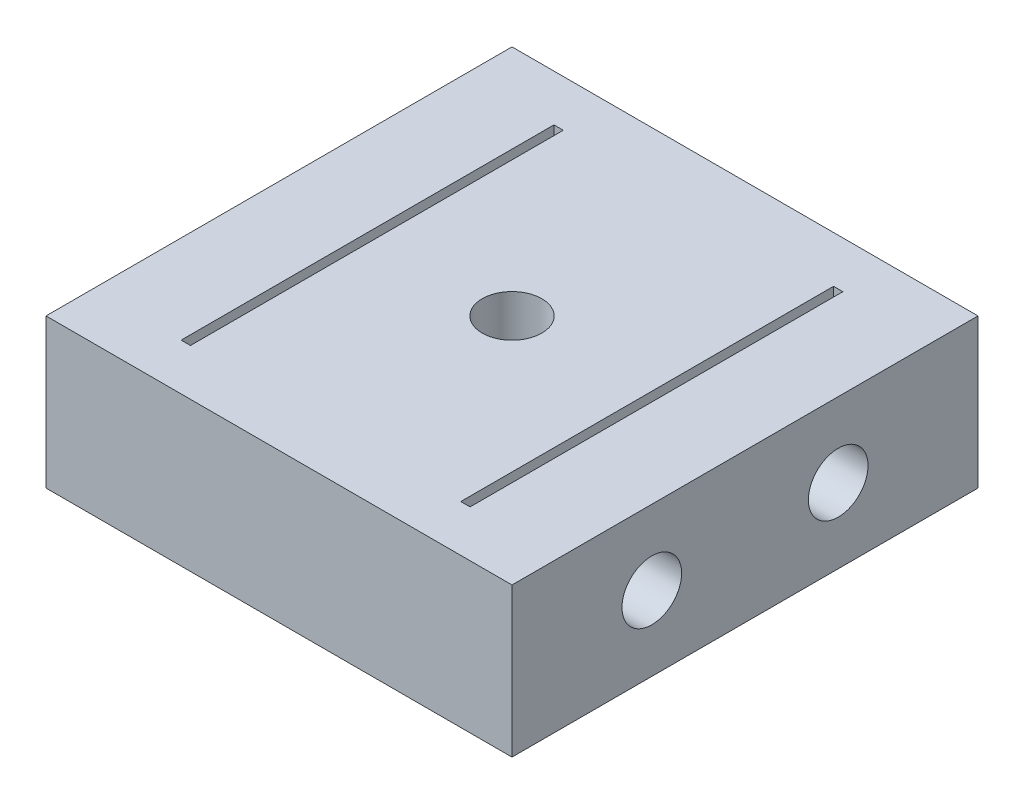
ISO-10303-21;
HEADER;
FILE_DESCRIPTION(('STEP AP214'),'2;1');
FILE_NAME('part.step','',(''),(''),'','','');
FILE_SCHEMA(('AUTOMOTIVE_DESIGN { 1 0 10303 214 1 1 1 1 }'));
ENDSEC;
DATA;
#1=APPLICATION_CONTEXT('core data for automotive mechanical design processes');
#2=APPLICATION_PROTOCOL_DEFINITION('international standard','automotive_design',2000,#1);
#3=PRODUCT_CONTEXT('',#1,'mechanical');
#4=PRODUCT('Part','Part','',(#3));
#5=PRODUCT_RELATED_PRODUCT_CATEGORY('part','',(#4));
#6=PRODUCT_DEFINITION_FORMATION('','',#4);
#7=PRODUCT_DEFINITION_CONTEXT('part definition',#1,'design');
#8=PRODUCT_DEFINITION('design','',#6,#7);
#9=PRODUCT_DEFINITION_SHAPE('','',#8);
#10=(LENGTH_UNIT() NAMED_UNIT(*) SI_UNIT(.MILLI.,.METRE.));
#11=(NAMED_UNIT(*) PLANE_ANGLE_UNIT() SI_UNIT($,.RADIAN.));
#12=(NAMED_UNIT(*) SI_UNIT($,.STERADIAN.) SOLID_ANGLE_UNIT());
#13=UNCERTAINTY_MEASURE_WITH_UNIT(LENGTH_MEASURE(1.E-05),#10,'distance_accuracy_value','');
#14=(GEOMETRIC_REPRESENTATION_CONTEXT(3) GLOBAL_UNCERTAINTY_ASSIGNED_CONTEXT((#13)) GLOBAL_UNIT_ASSIGNED_CONTEXT((#10,
#11,#12)) REPRESENTATION_CONTEXT('',''));
#15=CARTESIAN_POINT('',(0.,0.,0.));
#16=DIRECTION('',(0.,0.,1.));
#17=DIRECTION('',(1.,0.,0.));
#18=AXIS2_PLACEMENT_3D('',#15,#16,#17);
#19=CARTESIAN_POINT('',(0.,8.,0.));
#20=DIRECTION('',(0.,-1.,0.));
#21=DIRECTION('',(0.,0.,-1.));
#22=AXIS2_PLACEMENT_3D('',#19,#20,#21);
#23=PLANE('',#22);
#24=DIRECTION('',(0.,0.,1.));
#25=VECTOR('',#24,1.);
#26=CARTESIAN_POINT('',(4.74999999999998,8.,-22.5));
#27=LINE('',#26,#25);
#28=CARTESIAN_POINT('',(4.74999999999998,8.,-22.5));
#29=VERTEX_POINT('',#28);
#30=CARTESIAN_POINT('',(4.74999999999998,8.,-2.5));
#31=VERTEX_POINT('',#30);
#32=EDGE_CURVE('E169',#29,#31,#27,.T.);
#33=ORIENTED_EDGE('',*,*,#32,.F.);
#34=DIRECTION('',(-1.,0.,0.));
#35=VECTOR('',#34,1.);
#36=CARTESIAN_POINT('',(4.74999999999998,8.,-22.5));
#37=LINE('',#36,#35);
#38=CARTESIAN_POINT('',(5.24999999999998,8.,-22.5));
#39=VERTEX_POINT('',#38);
#40=EDGE_CURVE('E177',#39,#29,#37,.T.);
#41=ORIENTED_EDGE('',*,*,#40,.F.);
#42=DIRECTION('',(0.,0.,-1.));
#43=VECTOR('',#42,1.);
#44=CARTESIAN_POINT('',(5.24999999999998,8.,-22.5));
#45=LINE('',#44,#43);
#46=CARTESIAN_POINT('',(5.24999999999998,8.,-2.5));
#47=VERTEX_POINT('',#46);
#48=EDGE_CURVE('E174',#47,#39,#45,.T.);
#49=ORIENTED_EDGE('',*,*,#48,.F.);
#50=DIRECTION('',(1.,0.,0.));
#51=VECTOR('',#50,1.);
#52=CARTESIAN_POINT('',(4.74999999999998,8.,-2.5));
#53=LINE('',#52,#51);
#54=EDGE_CURVE('E171',#31,#47,#53,.T.);
#55=ORIENTED_EDGE('',*,*,#54,.F.);
#56=EDGE_LOOP('',(#33,#41,#49,#55));
#57=FACE_BOUND('',#56,.T.);
#58=DIRECTION('',(0.,0.,1.));
#59=VECTOR('',#58,1.);
#60=CARTESIAN_POINT('',(0.,8.,0.));
#61=LINE('',#60,#59);
#62=CARTESIAN_POINT('',(0.,8.,-25.));
#63=VERTEX_POINT('',#62);
#64=CARTESIAN_POINT('',(0.,8.,0.));
#65=VERTEX_POINT('',#64);
#66=EDGE_CURVE('E200',#63,#65,#61,.T.);
#67=ORIENTED_EDGE('',*,*,#66,.T.);
#68=DIRECTION('',(1.,0.,0.));
#69=VECTOR('',#68,1.);
#70=CARTESIAN_POINT('',(0.,8.,0.));
#71=LINE('',#70,#69);
#72=CARTESIAN_POINT('',(25.,8.,0.));
#73=VERTEX_POINT('',#72);
#74=EDGE_CURVE('E203',#65,#73,#71,.T.);
#75=ORIENTED_EDGE('',*,*,#74,.T.);
#76=DIRECTION('',(0.,0.,-1.));
#77=VECTOR('',#76,1.);
#78=CARTESIAN_POINT('',(25.,8.,0.));
#79=LINE('',#78,#77);
#80=CARTESIAN_POINT('',(25.,8.,-25.));
#81=VERTEX_POINT('',#80);
#82=EDGE_CURVE('E206',#73,#81,#79,.T.);
#83=ORIENTED_EDGE('',*,*,#82,.T.);
#84=DIRECTION('',(-1.,0.,0.));
#85=VECTOR('',#84,1.);
#86=CARTESIAN_POINT('',(0.,8.,-25.));
#87=LINE('',#86,#85);
#88=EDGE_CURVE('E208',#81,#63,#87,.T.);
#89=ORIENTED_EDGE('',*,*,#88,.T.);
#90=EDGE_LOOP('',(#67,#75,#83,#89));
#91=FACE_BOUND('',#90,.T.);
#92=DIRECTION('',(0.,0.,1.));
#93=VECTOR('',#92,1.);
#94=CARTESIAN_POINT('',(19.75,8.,-22.5));
#95=LINE('',#94,#93);
#96=CARTESIAN_POINT('',(19.75,8.,-22.5));
#97=VERTEX_POINT('',#96);
#98=CARTESIAN_POINT('',(19.75,8.,-2.5));
#99=VERTEX_POINT('',#98);
#100=EDGE_CURVE('E130',#97,#99,#95,.T.);
#101=ORIENTED_EDGE('',*,*,#100,.F.);
#102=DIRECTION('',(-1.,0.,0.));
#103=VECTOR('',#102,1.);
#104=CARTESIAN_POINT('',(19.75,8.,-22.5));
#105=LINE('',#104,#103);
#106=CARTESIAN_POINT('',(20.25,8.,-22.5));
#107=VERTEX_POINT('',#106);
#108=EDGE_CURVE('E153',#107,#97,#105,.T.);
#109=ORIENTED_EDGE('',*,*,#108,.F.);
#110=DIRECTION('',(0.,0.,-1.));
#111=VECTOR('',#110,1.);
#112=CARTESIAN_POINT('',(20.25,8.,-22.5));
#113=LINE('',#112,#111);
#114=CARTESIAN_POINT('',(20.25,8.,-2.5));
#115=VERTEX_POINT('',#114);
#116=EDGE_CURVE('E151',#115,#107,#113,.T.);
#117=ORIENTED_EDGE('',*,*,#116,.F.);
#118=DIRECTION('',(1.,0.,0.));
#119=VECTOR('',#118,1.);
#120=CARTESIAN_POINT('',(19.75,8.,-2.5));
#121=LINE('',#120,#119);
#122=EDGE_CURVE('E138',#99,#115,#121,.T.);
#123=ORIENTED_EDGE('',*,*,#122,.F.);
#124=EDGE_LOOP('',(#101,#109,#117,#123));
#125=FACE_BOUND('',#124,.T.);
#126=CARTESIAN_POINT('',(12.5,8.,-12.5));
#127=DIRECTION('',(0.,1.,0.));
#128=DIRECTION('',(0.,0.,1.));
#129=AXIS2_PLACEMENT_3D('',#126,#127,#128);
#130=CIRCLE('',#129,1.6);
#131=CARTESIAN_POINT('',(12.5,8.,-10.9));
#132=VERTEX_POINT('',#131);
#133=EDGE_CURVE('E159',#132,#132,#130,.T.);
#134=ORIENTED_EDGE('',*,*,#133,.F.);
#135=EDGE_LOOP('',(#134));
#136=FACE_BOUND('',#135,.T.);
#137=ADVANCED_FACE('F39',(#57,#91,#125,#136),#23,.F.);
#138=CARTESIAN_POINT('',(0.,0.,0.));
#139=DIRECTION('',(0.,-1.,0.));
#140=DIRECTION('',(0.,0.,-1.));
#141=AXIS2_PLACEMENT_3D('',#138,#139,#140);
#142=PLANE('',#141);
#143=DIRECTION('',(-1.,0.,0.));
#144=VECTOR('',#143,1.);
#145=CARTESIAN_POINT('',(19.75,0.,-22.5));
#146=LINE('',#145,#144);
#147=CARTESIAN_POINT('',(20.25,0.,-22.5));
#148=VERTEX_POINT('',#147);
#149=CARTESIAN_POINT('',(19.75,0.,-22.5));
#150=VERTEX_POINT('',#149);
#151=EDGE_CURVE('E139',#148,#150,#146,.T.);
#152=ORIENTED_EDGE('',*,*,#151,.T.);
#153=DIRECTION('',(0.,0.,1.));
#154=VECTOR('',#153,1.);
#155=CARTESIAN_POINT('',(19.75,0.,-22.5));
#156=LINE('',#155,#154);
#157=CARTESIAN_POINT('',(19.75,0.,-2.5));
#158=VERTEX_POINT('',#157);
#159=EDGE_CURVE('E64',#150,#158,#156,.T.);
#160=ORIENTED_EDGE('',*,*,#159,.T.);
#161=DIRECTION('',(1.,0.,0.));
#162=VECTOR('',#161,1.);
#163=CARTESIAN_POINT('',(19.75,0.,-2.5));
#164=LINE('',#163,#162);
#165=CARTESIAN_POINT('',(20.25,0.,-2.5));
#166=VERTEX_POINT('',#165);
#167=EDGE_CURVE('E145',#158,#166,#164,.T.);
#168=ORIENTED_EDGE('',*,*,#167,.T.);
#169=DIRECTION('',(0.,0.,-1.));
#170=VECTOR('',#169,1.);
#171=CARTESIAN_POINT('',(20.25,0.,-22.5));
#172=LINE('',#171,#170);
#173=EDGE_CURVE('E161',#166,#148,#172,.T.);
#174=ORIENTED_EDGE('',*,*,#173,.T.);
#175=EDGE_LOOP('',(#152,#160,#168,#174));
#176=FACE_BOUND('',#175,.T.);
#177=DIRECTION('',(-1.,0.,0.));
#178=VECTOR('',#177,1.);
#179=CARTESIAN_POINT('',(4.74999999999998,0.,-22.5));
#180=LINE('',#179,#178);
#181=CARTESIAN_POINT('',(5.24999999999998,0.,-22.5));
#182=VERTEX_POINT('',#181);
#183=CARTESIAN_POINT('',(4.74999999999998,0.,-22.5));
#184=VERTEX_POINT('',#183);
#185=EDGE_CURVE('E172',#182,#184,#180,.T.);
#186=ORIENTED_EDGE('',*,*,#185,.T.);
#187=DIRECTION('',(0.,0.,1.));
#188=VECTOR('',#187,1.);
#189=CARTESIAN_POINT('',(4.74999999999998,0.,-22.5));
#190=LINE('',#189,#188);
#191=CARTESIAN_POINT('',(4.74999999999998,0.,-2.5));
#192=VERTEX_POINT('',#191);
#193=EDGE_CURVE('E146',#184,#192,#190,.T.);
#194=ORIENTED_EDGE('',*,*,#193,.T.);
#195=DIRECTION('',(1.,0.,0.));
#196=VECTOR('',#195,1.);
#197=CARTESIAN_POINT('',(4.74999999999998,0.,-2.5));
#198=LINE('',#197,#196);
#199=CARTESIAN_POINT('',(5.24999999999998,0.,-2.5));
#200=VERTEX_POINT('',#199);
#201=EDGE_CURVE('E182',#192,#200,#198,.T.);
#202=ORIENTED_EDGE('',*,*,#201,.T.);
#203=DIRECTION('',(0.,0.,-1.));
#204=VECTOR('',#203,1.);
#205=CARTESIAN_POINT('',(5.24999999999998,0.,-22.5));
#206=LINE('',#205,#204);
#207=EDGE_CURVE('E185',#200,#182,#206,.T.);
#208=ORIENTED_EDGE('',*,*,#207,.T.);
#209=EDGE_LOOP('',(#186,#194,#202,#208));
#210=FACE_BOUND('',#209,.T.);
#211=DIRECTION('',(0.,0.,1.));
#212=VECTOR('',#211,1.);
#213=CARTESIAN_POINT('',(0.,0.,0.));
#214=LINE('',#213,#212);
#215=CARTESIAN_POINT('',(0.,0.,-25.));
#216=VERTEX_POINT('',#215);
#217=CARTESIAN_POINT('',(0.,0.,0.));
#218=VERTEX_POINT('',#217);
#219=EDGE_CURVE('E199',#216,#218,#214,.T.);
#220=ORIENTED_EDGE('',*,*,#219,.F.);
#221=DIRECTION('',(-1.,0.,0.));
#222=VECTOR('',#221,1.);
#223=CARTESIAN_POINT('',(0.,0.,-25.));
#224=LINE('',#223,#222);
#225=CARTESIAN_POINT('',(25.,0.,-25.));
#226=VERTEX_POINT('',#225);
#227=EDGE_CURVE('E204',#226,#216,#224,.T.);
#228=ORIENTED_EDGE('',*,*,#227,.F.);
#229=DIRECTION('',(0.,0.,-1.));
#230=VECTOR('',#229,1.);
#231=CARTESIAN_POINT('',(25.,0.,0.));
#232=LINE('',#231,#230);
#233=CARTESIAN_POINT('',(25.,0.,0.));
#234=VERTEX_POINT('',#233);
#235=EDGE_CURVE('E215',#234,#226,#232,.T.);
#236=ORIENTED_EDGE('',*,*,#235,.F.);
#237=DIRECTION('',(1.,0.,0.));
#238=VECTOR('',#237,1.);
#239=CARTESIAN_POINT('',(0.,0.,0.));
#240=LINE('',#239,#238);
#241=EDGE_CURVE('E213',#218,#234,#240,.T.);
#242=ORIENTED_EDGE('',*,*,#241,.F.);
#243=EDGE_LOOP('',(#220,#228,#236,#242));
#244=FACE_BOUND('',#243,.T.);
#245=CARTESIAN_POINT('',(12.5,0.,-12.5));
#246=DIRECTION('',(0.,1.,0.));
#247=DIRECTION('',(0.,0.,1.));
#248=AXIS2_PLACEMENT_3D('',#245,#246,#247);
#249=CIRCLE('',#248,1.6);
#250=CARTESIAN_POINT('',(12.5,0.,-10.9));
#251=VERTEX_POINT('',#250);
#252=EDGE_CURVE('E261',#251,#251,#249,.T.);
#253=ORIENTED_EDGE('',*,*,#252,.T.);
#254=EDGE_LOOP('',(#253));
#255=FACE_BOUND('',#254,.T.);
#256=ADVANCED_FACE('F266',(#176,#210,#244,#255),#142,.T.);
#257=CARTESIAN_POINT('',(0.,8.,0.));
#258=DIRECTION('',(1.,0.,0.));
#259=DIRECTION('',(0.,0.,-1.));
#260=AXIS2_PLACEMENT_3D('',#257,#258,#259);
#261=PLANE('',#260);
#262=CARTESIAN_POINT('',(0.,4.,-7.5));
#263=DIRECTION('',(1.,0.,0.));
#264=DIRECTION('',(0.,0.,-1.));
#265=AXIS2_PLACEMENT_3D('',#262,#263,#264);
#266=CIRCLE('',#265,1.6);
#267=CARTESIAN_POINT('',(0.,4.,-9.1));
#268=VERTEX_POINT('',#267);
#269=EDGE_CURVE('E227',#268,#268,#266,.T.);
#270=ORIENTED_EDGE('',*,*,#269,.T.);
#271=EDGE_LOOP('',(#270));
#272=FACE_BOUND('',#271,.T.);
#273=CARTESIAN_POINT('',(0.,4.,-17.5));
#274=DIRECTION('',(1.,0.,0.));
#275=DIRECTION('',(0.,0.,-1.));
#276=AXIS2_PLACEMENT_3D('',#273,#274,#275);
#277=CIRCLE('',#276,1.6);
#278=CARTESIAN_POINT('',(0.,4.,-19.1));
#279=VERTEX_POINT('',#278);
#280=EDGE_CURVE('E244',#279,#279,#277,.T.);
#281=ORIENTED_EDGE('',*,*,#280,.T.);
#282=EDGE_LOOP('',(#281));
#283=FACE_BOUND('',#282,.T.);
#284=ORIENTED_EDGE('',*,*,#219,.T.);
#285=DIRECTION('',(0.,-1.,0.));
#286=VECTOR('',#285,1.);
#287=CARTESIAN_POINT('',(0.,8.,0.));
#288=LINE('',#287,#286);
#289=EDGE_CURVE('E11',#65,#218,#288,.T.);
#290=ORIENTED_EDGE('',*,*,#289,.F.);
#291=ORIENTED_EDGE('',*,*,#66,.F.);
#292=DIRECTION('',(0.,-1.,0.));
#293=VECTOR('',#292,1.);
#294=CARTESIAN_POINT('',(0.,8.,-25.));
#295=LINE('',#294,#293);
#296=EDGE_CURVE('E210',#63,#216,#295,.T.);
#297=ORIENTED_EDGE('',*,*,#296,.T.);
#298=EDGE_LOOP('',(#284,#290,#291,#297));
#299=FACE_BOUND('',#298,.T.);
#300=ADVANCED_FACE('F41',(#272,#283,#299),#261,.F.);
#301=CARTESIAN_POINT('',(0.,8.,0.));
#302=DIRECTION('',(0.,0.,-1.));
#303=DIRECTION('',(-1.,0.,0.));
#304=AXIS2_PLACEMENT_3D('',#301,#302,#303);
#305=PLANE('',#304);
#306=ORIENTED_EDGE('',*,*,#241,.T.);
#307=DIRECTION('',(0.,-1.,0.));
#308=VECTOR('',#307,1.);
#309=CARTESIAN_POINT('',(25.,8.,0.));
#310=LINE('',#309,#308);
#311=EDGE_CURVE('E48',#73,#234,#310,.T.);
#312=ORIENTED_EDGE('',*,*,#311,.F.);
#313=ORIENTED_EDGE('',*,*,#74,.F.);
#314=ORIENTED_EDGE('',*,*,#289,.T.);
#315=EDGE_LOOP('',(#306,#312,#313,#314));
#316=FACE_BOUND('',#315,.T.);
#317=ADVANCED_FACE('F305',(#316),#305,.F.);
#318=CARTESIAN_POINT('',(25.,8.,0.));
#319=DIRECTION('',(-1.,0.,0.));
#320=DIRECTION('',(0.,0.,1.));
#321=AXIS2_PLACEMENT_3D('',#318,#319,#320);
#322=PLANE('',#321);
#323=CARTESIAN_POINT('',(25.,4.,-7.5));
#324=DIRECTION('',(1.,0.,0.));
#325=DIRECTION('',(0.,0.,-1.));
#326=AXIS2_PLACEMENT_3D('',#323,#324,#325);
#327=CIRCLE('',#326,1.6);
#328=CARTESIAN_POINT('',(25.,4.,-9.1));
#329=VERTEX_POINT('',#328);
#330=EDGE_CURVE('E234',#329,#329,#327,.T.);
#331=ORIENTED_EDGE('',*,*,#330,.F.);
#332=EDGE_LOOP('',(#331));
#333=FACE_BOUND('',#332,.T.);
#334=CARTESIAN_POINT('',(25.,4.,-17.5));
#335=DIRECTION('',(1.,0.,0.));
#336=DIRECTION('',(0.,0.,-1.));
#337=AXIS2_PLACEMENT_3D('',#334,#335,#336);
#338=CIRCLE('',#337,1.6);
#339=CARTESIAN_POINT('',(25.,4.,-19.1));
#340=VERTEX_POINT('',#339);
#341=EDGE_CURVE('E239',#340,#340,#338,.T.);
#342=ORIENTED_EDGE('',*,*,#341,.F.);
#343=EDGE_LOOP('',(#342));
#344=FACE_BOUND('',#343,.T.);
#345=ORIENTED_EDGE('',*,*,#235,.T.);
#346=DIRECTION('',(0.,-1.,0.));
#347=VECTOR('',#346,1.);
#348=CARTESIAN_POINT('',(25.,8.,-25.));
#349=LINE('',#348,#347);
#350=EDGE_CURVE('E220',#81,#226,#349,.T.);
#351=ORIENTED_EDGE('',*,*,#350,.F.);
#352=ORIENTED_EDGE('',*,*,#82,.F.);
#353=ORIENTED_EDGE('',*,*,#311,.T.);
#354=EDGE_LOOP('',(#345,#351,#352,#353));
#355=FACE_BOUND('',#354,.T.);
#356=ADVANCED_FACE('F302',(#333,#344,#355),#322,.F.);
#357=CARTESIAN_POINT('',(0.,8.,-25.));
#358=DIRECTION('',(0.,0.,1.));
#359=DIRECTION('',(1.,0.,0.));
#360=AXIS2_PLACEMENT_3D('',#357,#358,#359);
#361=PLANE('',#360);
#362=ORIENTED_EDGE('',*,*,#227,.T.);
#363=ORIENTED_EDGE('',*,*,#296,.F.);
#364=ORIENTED_EDGE('',*,*,#88,.F.);
#365=ORIENTED_EDGE('',*,*,#350,.T.);
#366=EDGE_LOOP('',(#362,#363,#364,#365));
#367=FACE_BOUND('',#366,.T.);
#368=ADVANCED_FACE('F299',(#367),#361,.F.);
#369=CARTESIAN_POINT('',(4.74999999999998,8.,-22.5));
#370=DIRECTION('',(1.,0.,0.));
#371=DIRECTION('',(0.,0.,-1.));
#372=AXIS2_PLACEMENT_3D('',#369,#370,#371);
#373=PLANE('',#372);
#374=CARTESIAN_POINT('',(4.74999999999998,4.,-7.5));
#375=DIRECTION('',(1.,0.,0.));
#376=DIRECTION('',(0.,0.,-1.));
#377=AXIS2_PLACEMENT_3D('',#374,#375,#376);
#378=CIRCLE('',#377,1.6);
#379=CARTESIAN_POINT('',(4.74999999999998,4.,-9.1));
#380=VERTEX_POINT('',#379);
#381=EDGE_CURVE('E258',#380,#380,#378,.T.);
#382=ORIENTED_EDGE('',*,*,#381,.F.);
#383=EDGE_LOOP('',(#382));
#384=FACE_BOUND('',#383,.T.);
#385=CARTESIAN_POINT('',(4.74999999999998,4.,-17.5));
#386=DIRECTION('',(1.,0.,0.));
#387=DIRECTION('',(0.,0.,-1.));
#388=AXIS2_PLACEMENT_3D('',#385,#386,#387);
#389=CIRCLE('',#388,1.6);
#390=CARTESIAN_POINT('',(4.74999999999998,4.,-19.1));
#391=VERTEX_POINT('',#390);
#392=EDGE_CURVE('E249',#391,#391,#389,.T.);
#393=ORIENTED_EDGE('',*,*,#392,.F.);
#394=EDGE_LOOP('',(#393));
#395=FACE_BOUND('',#394,.T.);
#396=ORIENTED_EDGE('',*,*,#193,.F.);
#397=DIRECTION('',(0.,-1.,0.));
#398=VECTOR('',#397,1.);
#399=CARTESIAN_POINT('',(4.74999999999998,8.,-22.5));
#400=LINE('',#399,#398);
#401=EDGE_CURVE('E179',#29,#184,#400,.T.);
#402=ORIENTED_EDGE('',*,*,#401,.F.);
#403=ORIENTED_EDGE('',*,*,#32,.T.);
#404=DIRECTION('',(0.,-1.,0.));
#405=VECTOR('',#404,1.);
#406=CARTESIAN_POINT('',(4.74999999999998,8.,-2.5));
#407=LINE('',#406,#405);
#408=EDGE_CURVE('E196',#31,#192,#407,.T.);
#409=ORIENTED_EDGE('',*,*,#408,.T.);
#410=EDGE_LOOP('',(#396,#402,#403,#409));
#411=FACE_BOUND('',#410,.T.);
#412=ADVANCED_FACE('F296',(#384,#395,#411),#373,.T.);
#413=CARTESIAN_POINT('',(4.74999999999998,8.,-2.5));
#414=DIRECTION('',(0.,0.,-1.));
#415=DIRECTION('',(-1.,0.,0.));
#416=AXIS2_PLACEMENT_3D('',#413,#414,#415);
#417=PLANE('',#416);
#418=ORIENTED_EDGE('',*,*,#201,.F.);
#419=ORIENTED_EDGE('',*,*,#408,.F.);
#420=ORIENTED_EDGE('',*,*,#54,.T.);
#421=DIRECTION('',(0.,-1.,0.));
#422=VECTOR('',#421,1.);
#423=CARTESIAN_POINT('',(5.24999999999998,8.,-2.5));
#424=LINE('',#423,#422);
#425=EDGE_CURVE('E194',#47,#200,#424,.T.);
#426=ORIENTED_EDGE('',*,*,#425,.T.);
#427=EDGE_LOOP('',(#418,#419,#420,#426));
#428=FACE_BOUND('',#427,.T.);
#429=ADVANCED_FACE('F367',(#428),#417,.T.);
#430=CARTESIAN_POINT('',(5.24999999999998,8.,-22.5));
#431=DIRECTION('',(-1.,0.,0.));
#432=DIRECTION('',(0.,0.,1.));
#433=AXIS2_PLACEMENT_3D('',#430,#431,#432);
#434=PLANE('',#433);
#435=CARTESIAN_POINT('',(5.24999999999998,4.,-7.5));
#436=DIRECTION('',(-1.,0.,0.));
#437=DIRECTION('',(0.,0.,1.));
#438=AXIS2_PLACEMENT_3D('',#435,#436,#437);
#439=CIRCLE('',#438,1.6);
#440=CARTESIAN_POINT('',(5.24999999999998,4.,-5.9));
#441=VERTEX_POINT('',#440);
#442=EDGE_CURVE('E255',#441,#441,#439,.T.);
#443=ORIENTED_EDGE('',*,*,#442,.F.);
#444=EDGE_LOOP('',(#443));
#445=FACE_BOUND('',#444,.T.);
#446=CARTESIAN_POINT('',(5.24999999999998,4.,-17.5));
#447=DIRECTION('',(-1.,0.,0.));
#448=DIRECTION('',(0.,0.,1.));
#449=AXIS2_PLACEMENT_3D('',#446,#447,#448);
#450=CIRCLE('',#449,1.6);
#451=CARTESIAN_POINT('',(5.24999999999998,4.,-15.9));
#452=VERTEX_POINT('',#451);
#453=EDGE_CURVE('E231',#452,#452,#450,.T.);
#454=ORIENTED_EDGE('',*,*,#453,.F.);
#455=EDGE_LOOP('',(#454));
#456=FACE_BOUND('',#455,.T.);
#457=ORIENTED_EDGE('',*,*,#207,.F.);
#458=ORIENTED_EDGE('',*,*,#425,.F.);
#459=ORIENTED_EDGE('',*,*,#48,.T.);
#460=DIRECTION('',(0.,-1.,0.));
#461=VECTOR('',#460,1.);
#462=CARTESIAN_POINT('',(5.24999999999998,8.,-22.5));
#463=LINE('',#462,#461);
#464=EDGE_CURVE('E192',#39,#182,#463,.T.);
#465=ORIENTED_EDGE('',*,*,#464,.T.);
#466=EDGE_LOOP('',(#457,#458,#459,#465));
#467=FACE_BOUND('',#466,.T.);
#468=ADVANCED_FACE('F361',(#445,#456,#467),#434,.T.);
#469=CARTESIAN_POINT('',(4.74999999999998,8.,-22.5));
#470=DIRECTION('',(0.,0.,1.));
#471=DIRECTION('',(1.,0.,0.));
#472=AXIS2_PLACEMENT_3D('',#469,#470,#471);
#473=PLANE('',#472);
#474=ORIENTED_EDGE('',*,*,#185,.F.);
#475=ORIENTED_EDGE('',*,*,#464,.F.);
#476=ORIENTED_EDGE('',*,*,#40,.T.);
#477=ORIENTED_EDGE('',*,*,#401,.T.);
#478=EDGE_LOOP('',(#474,#475,#476,#477));
#479=FACE_BOUND('',#478,.T.);
#480=ADVANCED_FACE('F351',(#479),#473,.T.);
#481=CARTESIAN_POINT('',(19.75,8.,-22.5));
#482=DIRECTION('',(1.,0.,0.));
#483=DIRECTION('',(0.,0.,-1.));
#484=AXIS2_PLACEMENT_3D('',#481,#482,#483);
#485=PLANE('',#484);
#486=CARTESIAN_POINT('',(19.75,4.,-7.5));
#487=DIRECTION('',(1.,0.,0.));
#488=DIRECTION('',(0.,0.,-1.));
#489=AXIS2_PLACEMENT_3D('',#486,#487,#488);
#490=CIRCLE('',#489,1.6);
#491=CARTESIAN_POINT('',(19.75,4.,-9.1));
#492=VERTEX_POINT('',#491);
#493=EDGE_CURVE('E252',#492,#492,#490,.T.);
#494=ORIENTED_EDGE('',*,*,#493,.F.);
#495=EDGE_LOOP('',(#494));
#496=FACE_BOUND('',#495,.T.);
#497=CARTESIAN_POINT('',(19.75,4.,-17.5));
#498=DIRECTION('',(1.,0.,0.));
#499=DIRECTION('',(0.,0.,-1.));
#500=AXIS2_PLACEMENT_3D('',#497,#498,#499);
#501=CIRCLE('',#500,1.6);
#502=CARTESIAN_POINT('',(19.75,4.,-19.1));
#503=VERTEX_POINT('',#502);
#504=EDGE_CURVE('E226',#503,#503,#501,.T.);
#505=ORIENTED_EDGE('',*,*,#504,.F.);
#506=EDGE_LOOP('',(#505));
#507=FACE_BOUND('',#506,.T.);
#508=ORIENTED_EDGE('',*,*,#159,.F.);
#509=DIRECTION('',(0.,-1.,0.));
#510=VECTOR('',#509,1.);
#511=CARTESIAN_POINT('',(19.75,8.,-22.5));
#512=LINE('',#511,#510);
#513=EDGE_CURVE('E134',#97,#150,#512,.T.);
#514=ORIENTED_EDGE('',*,*,#513,.F.);
#515=ORIENTED_EDGE('',*,*,#100,.T.);
#516=DIRECTION('',(0.,-1.,0.));
#517=VECTOR('',#516,1.);
#518=CARTESIAN_POINT('',(19.75,8.,-2.5));
#519=LINE('',#518,#517);
#520=EDGE_CURVE('E133',#99,#158,#519,.T.);
#521=ORIENTED_EDGE('',*,*,#520,.T.);
#522=EDGE_LOOP('',(#508,#514,#515,#521));
#523=FACE_BOUND('',#522,.T.);
#524=ADVANCED_FACE('F132',(#496,#507,#523),#485,.T.);
#525=CARTESIAN_POINT('',(19.75,8.,-2.5));
#526=DIRECTION('',(0.,0.,-1.));
#527=DIRECTION('',(-1.,0.,0.));
#528=AXIS2_PLACEMENT_3D('',#525,#526,#527);
#529=PLANE('',#528);
#530=ORIENTED_EDGE('',*,*,#167,.F.);
#531=ORIENTED_EDGE('',*,*,#520,.F.);
#532=ORIENTED_EDGE('',*,*,#122,.T.);
#533=DIRECTION('',(0.,-1.,0.));
#534=VECTOR('',#533,1.);
#535=CARTESIAN_POINT('',(20.25,8.,-2.5));
#536=LINE('',#535,#534);
#537=EDGE_CURVE('E147',#115,#166,#536,.T.);
#538=ORIENTED_EDGE('',*,*,#537,.T.);
#539=EDGE_LOOP('',(#530,#531,#532,#538));
#540=FACE_BOUND('',#539,.T.);
#541=ADVANCED_FACE('F142',(#540),#529,.T.);
#542=CARTESIAN_POINT('',(20.25,8.,-22.5));
#543=DIRECTION('',(-1.,0.,0.));
#544=DIRECTION('',(0.,0.,1.));
#545=AXIS2_PLACEMENT_3D('',#542,#543,#544);
#546=PLANE('',#545);
#547=CARTESIAN_POINT('',(20.25,4.,-7.5));
#548=DIRECTION('',(-1.,0.,0.));
#549=DIRECTION('',(0.,0.,1.));
#550=AXIS2_PLACEMENT_3D('',#547,#548,#549);
#551=CIRCLE('',#550,1.6);
#552=CARTESIAN_POINT('',(20.25,4.,-5.9));
#553=VERTEX_POINT('',#552);
#554=EDGE_CURVE('E43',#553,#553,#551,.T.);
#555=ORIENTED_EDGE('',*,*,#554,.F.);
#556=EDGE_LOOP('',(#555));
#557=FACE_BOUND('',#556,.T.);
#558=CARTESIAN_POINT('',(20.25,4.,-17.5));
#559=DIRECTION('',(-1.,0.,0.));
#560=DIRECTION('',(0.,0.,1.));
#561=AXIS2_PLACEMENT_3D('',#558,#559,#560);
#562=CIRCLE('',#561,1.6);
#563=CARTESIAN_POINT('',(20.25,4.,-15.9));
#564=VERTEX_POINT('',#563);
#565=EDGE_CURVE('E224',#564,#564,#562,.T.);
#566=ORIENTED_EDGE('',*,*,#565,.F.);
#567=EDGE_LOOP('',(#566));
#568=FACE_BOUND('',#567,.T.);
#569=ORIENTED_EDGE('',*,*,#173,.F.);
#570=ORIENTED_EDGE('',*,*,#537,.F.);
#571=ORIENTED_EDGE('',*,*,#116,.T.);
#572=DIRECTION('',(0.,-1.,0.));
#573=VECTOR('',#572,1.);
#574=CARTESIAN_POINT('',(20.25,8.,-22.5));
#575=LINE('',#574,#573);
#576=EDGE_CURVE('E56',#107,#148,#575,.T.);
#577=ORIENTED_EDGE('',*,*,#576,.T.);
#578=EDGE_LOOP('',(#569,#570,#571,#577));
#579=FACE_BOUND('',#578,.T.);
#580=ADVANCED_FACE('F283',(#557,#568,#579),#546,.T.);
#581=CARTESIAN_POINT('',(19.75,8.,-22.5));
#582=DIRECTION('',(0.,0.,1.));
#583=DIRECTION('',(1.,0.,0.));
#584=AXIS2_PLACEMENT_3D('',#581,#582,#583);
#585=PLANE('',#584);
#586=ORIENTED_EDGE('',*,*,#151,.F.);
#587=ORIENTED_EDGE('',*,*,#576,.F.);
#588=ORIENTED_EDGE('',*,*,#108,.T.);
#589=ORIENTED_EDGE('',*,*,#513,.T.);
#590=EDGE_LOOP('',(#586,#587,#588,#589));
#591=FACE_BOUND('',#590,.T.);
#592=ADVANCED_FACE('F271',(#591),#585,.T.);
#593=CARTESIAN_POINT('',(12.5,8.,-12.5));
#594=DIRECTION('',(0.,-1.,0.));
#595=DIRECTION('',(0.,0.,-1.));
#596=AXIS2_PLACEMENT_3D('',#593,#594,#595);
#597=CYLINDRICAL_SURFACE('',#596,1.6);
#598=ORIENTED_EDGE('',*,*,#133,.T.);
#599=EDGE_LOOP('',(#598));
#600=FACE_BOUND('',#599,.T.);
#601=ORIENTED_EDGE('',*,*,#252,.F.);
#602=EDGE_LOOP('',(#601));
#603=FACE_BOUND('',#602,.T.);
#604=ADVANCED_FACE('F268',(#600,#603),#597,.F.);
#605=CARTESIAN_POINT('',(0.,4.,-17.5));
#606=DIRECTION('',(1.,0.,0.));
#607=DIRECTION('',(0.,0.,-1.));
#608=AXIS2_PLACEMENT_3D('',#605,#606,#607);
#609=CYLINDRICAL_SURFACE('',#608,1.6);
#610=ORIENTED_EDGE('',*,*,#565,.T.);
#611=EDGE_LOOP('',(#610));
#612=FACE_BOUND('',#611,.T.);
#613=ORIENTED_EDGE('',*,*,#341,.T.);
#614=EDGE_LOOP('',(#613));
#615=FACE_BOUND('',#614,.T.);
#616=ADVANCED_FACE('F270',(#612,#615),#609,.F.);
#617=CARTESIAN_POINT('',(0.,4.,-7.5));
#618=DIRECTION('',(1.,0.,0.));
#619=DIRECTION('',(0.,0.,-1.));
#620=AXIS2_PLACEMENT_3D('',#617,#618,#619);
#621=CYLINDRICAL_SURFACE('',#620,1.6);
#622=ORIENTED_EDGE('',*,*,#554,.T.);
#623=EDGE_LOOP('',(#622));
#624=FACE_BOUND('',#623,.T.);
#625=ORIENTED_EDGE('',*,*,#330,.T.);
#626=EDGE_LOOP('',(#625));
#627=FACE_BOUND('',#626,.T.);
#628=ADVANCED_FACE('F279',(#624,#627),#621,.F.);
#629=ORIENTED_EDGE('',*,*,#453,.T.);
#630=EDGE_LOOP('',(#629));
#631=FACE_BOUND('',#630,.T.);
#632=ORIENTED_EDGE('',*,*,#504,.T.);
#633=EDGE_LOOP('',(#632));
#634=FACE_BOUND('',#633,.T.);
#635=ADVANCED_FACE('F282',(#631,#634),#609,.F.);
#636=ORIENTED_EDGE('',*,*,#442,.T.);
#637=EDGE_LOOP('',(#636));
#638=FACE_BOUND('',#637,.T.);
#639=ORIENTED_EDGE('',*,*,#493,.T.);
#640=EDGE_LOOP('',(#639));
#641=FACE_BOUND('',#640,.T.);
#642=ADVANCED_FACE('F331',(#638,#641),#621,.F.);
#643=ORIENTED_EDGE('',*,*,#392,.T.);
#644=EDGE_LOOP('',(#643));
#645=FACE_BOUND('',#644,.T.);
#646=ORIENTED_EDGE('',*,*,#280,.F.);
#647=EDGE_LOOP('',(#646));
#648=FACE_BOUND('',#647,.T.);
#649=ADVANCED_FACE('F281',(#645,#648),#609,.F.);
#650=ORIENTED_EDGE('',*,*,#381,.T.);
#651=EDGE_LOOP('',(#650));
#652=FACE_BOUND('',#651,.T.);
#653=ORIENTED_EDGE('',*,*,#269,.F.);
#654=EDGE_LOOP('',(#653));
#655=FACE_BOUND('',#654,.T.);
#656=ADVANCED_FACE('F330',(#652,#655),#621,.F.);
#657=CLOSED_SHELL('',(#137,#256,#300,#317,#356,#368,#412,#429,#468,#480,#524,#541,#580,#592,
#604,#616,#628,#635,#642,#649,#656));
#658=MANIFOLD_SOLID_BREP('B2',#657);
#659=ADVANCED_BREP_SHAPE_REPRESENTATION('',(#18,#658),#14);
#660=SHAPE_DEFINITION_REPRESENTATION(#9,#659);
ENDSEC;
END-ISO-10303-21;
